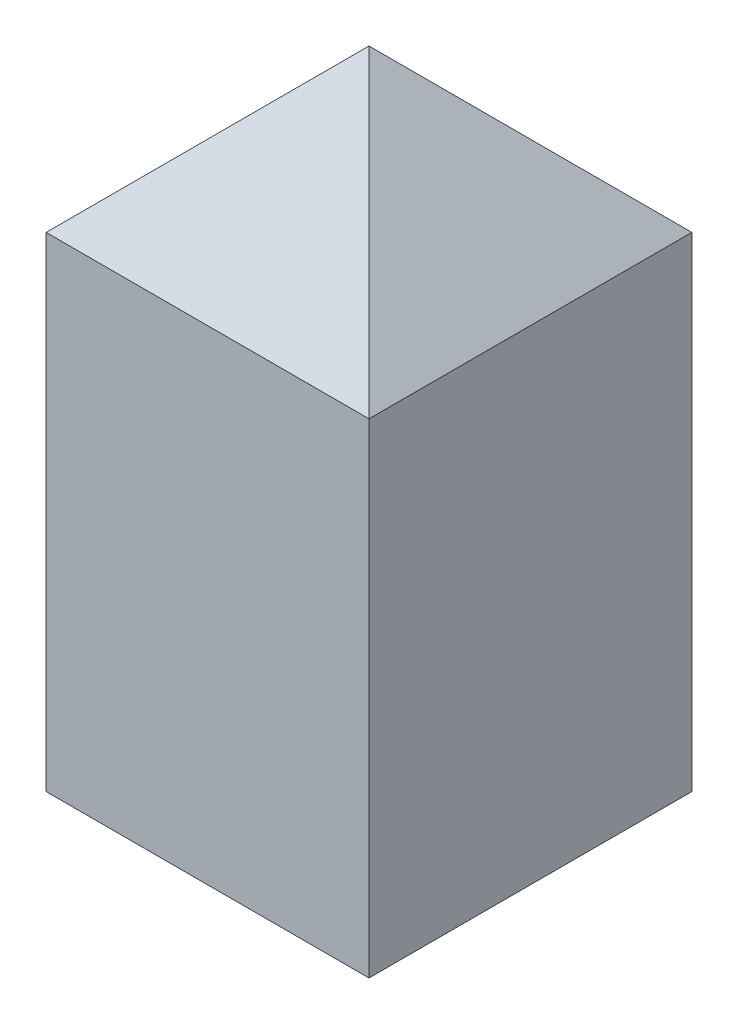
ISO-10303-21;
HEADER;
FILE_DESCRIPTION(('STEP AP214'),'2;1');
FILE_NAME('part.step','',(''),(''),'','','');
FILE_SCHEMA(('AUTOMOTIVE_DESIGN { 1 0 10303 214 1 1 1 1 }'));
ENDSEC;
DATA;
#1=APPLICATION_CONTEXT('core data for automotive mechanical design processes');
#2=APPLICATION_PROTOCOL_DEFINITION('international standard','automotive_design',2000,#1);
#3=PRODUCT_CONTEXT('',#1,'mechanical');
#4=PRODUCT('Part','Part','',(#3));
#5=PRODUCT_RELATED_PRODUCT_CATEGORY('part','',(#4));
#6=PRODUCT_DEFINITION_FORMATION('','',#4);
#7=PRODUCT_DEFINITION_CONTEXT('part definition',#1,'design');
#8=PRODUCT_DEFINITION('design','',#6,#7);
#9=PRODUCT_DEFINITION_SHAPE('','',#8);
#10=(LENGTH_UNIT() NAMED_UNIT(*) SI_UNIT(.MILLI.,.METRE.));
#11=(NAMED_UNIT(*) PLANE_ANGLE_UNIT() SI_UNIT($,.RADIAN.));
#12=(NAMED_UNIT(*) SI_UNIT($,.STERADIAN.) SOLID_ANGLE_UNIT());
#13=UNCERTAINTY_MEASURE_WITH_UNIT(LENGTH_MEASURE(1.E-05),#10,'distance_accuracy_value','');
#14=(GEOMETRIC_REPRESENTATION_CONTEXT(3) GLOBAL_UNCERTAINTY_ASSIGNED_CONTEXT((#13)) GLOBAL_UNIT_ASSIGNED_CONTEXT((#10,
#11,#12)) REPRESENTATION_CONTEXT('',''));
#15=CARTESIAN_POINT('',(0.,0.,0.));
#16=DIRECTION('',(0.,0.,1.));
#17=DIRECTION('',(1.,0.,0.));
#18=AXIS2_PLACEMENT_3D('',#15,#16,#17);
#19=CARTESIAN_POINT('',(-10.,-15.,-10.));
#20=DIRECTION('',(0.,0.,1.));
#21=DIRECTION('',(1.,0.,0.));
#22=AXIS2_PLACEMENT_3D('',#19,#20,#21);
#23=PLANE('',#22);
#24=DIRECTION('',(0.,1.,0.));
#25=VECTOR('',#24,1.);
#26=CARTESIAN_POINT('',(-10.,-15.,-10.));
#27=LINE('',#26,#25);
#28=CARTESIAN_POINT('',(-10.,-15.,-10.));
#29=VERTEX_POINT('',#28);
#30=CARTESIAN_POINT('',(-10.,15.,-10.));
#31=VERTEX_POINT('',#30);
#32=EDGE_CURVE('E194',#29,#31,#27,.T.);
#33=ORIENTED_EDGE('',*,*,#32,.T.);
#34=DIRECTION('',(1.,0.,0.));
#35=VECTOR('',#34,1.);
#36=CARTESIAN_POINT('',(-10.,15.,-10.));
#37=LINE('',#36,#35);
#38=CARTESIAN_POINT('',(10.,15.,-10.));
#39=VERTEX_POINT('',#38);
#40=EDGE_CURVE('E235',#31,#39,#37,.T.);
#41=ORIENTED_EDGE('',*,*,#40,.T.);
#42=DIRECTION('',(0.,1.,0.));
#43=VECTOR('',#42,1.);
#44=CARTESIAN_POINT('',(10.,-15.,-10.));
#45=LINE('',#44,#43);
#46=CARTESIAN_POINT('',(10.,-15.,-10.));
#47=VERTEX_POINT('',#46);
#48=EDGE_CURVE('E12',#47,#39,#45,.T.);
#49=ORIENTED_EDGE('',*,*,#48,.F.);
#50=DIRECTION('',(1.,0.,0.));
#51=VECTOR('',#50,1.);
#52=CARTESIAN_POINT('',(-10.,-15.,-10.));
#53=LINE('',#52,#51);
#54=EDGE_CURVE('E201',#29,#47,#53,.T.);
#55=ORIENTED_EDGE('',*,*,#54,.F.);
#56=EDGE_LOOP('',(#33,#41,#49,#55));
#57=FACE_BOUND('',#56,.T.);
#58=ADVANCED_FACE('F142',(#57),#23,.F.);
#59=CARTESIAN_POINT('',(10.,-15.,-10.));
#60=DIRECTION('',(-1.,0.,0.));
#61=DIRECTION('',(0.,0.,1.));
#62=AXIS2_PLACEMENT_3D('',#59,#60,#61);
#63=PLANE('',#62);
#64=ORIENTED_EDGE('',*,*,#48,.T.);
#65=DIRECTION('',(0.,0.,1.));
#66=VECTOR('',#65,1.);
#67=CARTESIAN_POINT('',(10.,15.,-10.));
#68=LINE('',#67,#66);
#69=CARTESIAN_POINT('',(10.,15.,10.));
#70=VERTEX_POINT('',#69);
#71=EDGE_CURVE('E232',#39,#70,#68,.T.);
#72=ORIENTED_EDGE('',*,*,#71,.T.);
#73=DIRECTION('',(0.,1.,0.));
#74=VECTOR('',#73,1.);
#75=CARTESIAN_POINT('',(10.,-15.,10.));
#76=LINE('',#75,#74);
#77=CARTESIAN_POINT('',(10.,-15.,10.));
#78=VERTEX_POINT('',#77);
#79=EDGE_CURVE('E149',#78,#70,#76,.T.);
#80=ORIENTED_EDGE('',*,*,#79,.F.);
#81=DIRECTION('',(0.,0.,1.));
#82=VECTOR('',#81,1.);
#83=CARTESIAN_POINT('',(10.,-15.,-10.));
#84=LINE('',#83,#82);
#85=EDGE_CURVE('E214',#47,#78,#84,.T.);
#86=ORIENTED_EDGE('',*,*,#85,.F.);
#87=EDGE_LOOP('',(#64,#72,#80,#86));
#88=FACE_BOUND('',#87,.T.);
#89=ADVANCED_FACE('F233',(#88),#63,.F.);
#90=CARTESIAN_POINT('',(-10.,-15.,10.));
#91=DIRECTION('',(0.,0.,1.));
#92=DIRECTION('',(1.,0.,0.));
#93=AXIS2_PLACEMENT_3D('',#90,#91,#92);
#94=PLANE('',#93);
#95=ORIENTED_EDGE('',*,*,#79,.T.);
#96=DIRECTION('',(1.,0.,0.));
#97=VECTOR('',#96,1.);
#98=CARTESIAN_POINT('',(-10.,15.,10.));
#99=LINE('',#98,#97);
#100=CARTESIAN_POINT('',(-10.,15.,10.));
#101=VERTEX_POINT('',#100);
#102=EDGE_CURVE('E217',#101,#70,#99,.T.);
#103=ORIENTED_EDGE('',*,*,#102,.F.);
#104=DIRECTION('',(0.,1.,0.));
#105=VECTOR('',#104,1.);
#106=CARTESIAN_POINT('',(-10.,-15.,10.));
#107=LINE('',#106,#105);
#108=CARTESIAN_POINT('',(-10.,-15.,10.));
#109=VERTEX_POINT('',#108);
#110=EDGE_CURVE('E211',#109,#101,#107,.T.);
#111=ORIENTED_EDGE('',*,*,#110,.F.);
#112=DIRECTION('',(1.,0.,0.));
#113=VECTOR('',#112,1.);
#114=CARTESIAN_POINT('',(-10.,-15.,10.));
#115=LINE('',#114,#113);
#116=EDGE_CURVE('E195',#109,#78,#115,.T.);
#117=ORIENTED_EDGE('',*,*,#116,.T.);
#118=EDGE_LOOP('',(#95,#103,#111,#117));
#119=FACE_BOUND('',#118,.T.);
#120=ADVANCED_FACE('F228',(#119),#94,.T.);
#121=CARTESIAN_POINT('',(-10.,-15.,-10.));
#122=DIRECTION('',(-1.,0.,0.));
#123=DIRECTION('',(0.,0.,1.));
#124=AXIS2_PLACEMENT_3D('',#121,#122,#123);
#125=PLANE('',#124);
#126=ORIENTED_EDGE('',*,*,#110,.T.);
#127=DIRECTION('',(0.,0.,1.));
#128=VECTOR('',#127,1.);
#129=CARTESIAN_POINT('',(-10.,15.,-10.));
#130=LINE('',#129,#128);
#131=EDGE_CURVE('E208',#31,#101,#130,.T.);
#132=ORIENTED_EDGE('',*,*,#131,.F.);
#133=ORIENTED_EDGE('',*,*,#32,.F.);
#134=DIRECTION('',(0.,0.,1.));
#135=VECTOR('',#134,1.);
#136=CARTESIAN_POINT('',(-10.,-15.,-10.));
#137=LINE('',#136,#135);
#138=EDGE_CURVE('E186',#29,#109,#137,.T.);
#139=ORIENTED_EDGE('',*,*,#138,.T.);
#140=EDGE_LOOP('',(#126,#132,#133,#139));
#141=FACE_BOUND('',#140,.T.);
#142=ADVANCED_FACE('F207',(#141),#125,.T.);
#143=CARTESIAN_POINT('',(10.,15.,9.99999999999999));
#144=DIRECTION('',(0.707106781186548,0.707106781186547,0.));
#145=DIRECTION('',(0.,0.,-1.));
#146=AXIS2_PLACEMENT_3D('',#143,#144,#145);
#147=PLANE('',#146);
#148=ORIENTED_EDGE('',*,*,#71,.F.);
#149=DIRECTION('',(-0.577350269189626,0.577350269189626,0.577350269189626));
#150=VECTOR('',#149,1.);
#151=CARTESIAN_POINT('',(5.,20.,-5.));
#152=LINE('',#151,#150);
#153=CARTESIAN_POINT('',(0.,25.,0.));
#154=VERTEX_POINT('',#153);
#155=EDGE_CURVE('E237',#39,#154,#152,.T.);
#156=ORIENTED_EDGE('',*,*,#155,.T.);
#157=DIRECTION('',(-0.577350269189626,0.577350269189626,-0.577350269189626));
#158=VECTOR('',#157,1.);
#159=CARTESIAN_POINT('',(5.,20.,5.));
#160=LINE('',#159,#158);
#161=EDGE_CURVE('E164',#70,#154,#160,.T.);
#162=ORIENTED_EDGE('',*,*,#161,.F.);
#163=EDGE_LOOP('',(#148,#156,#162));
#164=FACE_BOUND('',#163,.T.);
#165=ADVANCED_FACE('F274',(#164),#147,.T.);
#166=CARTESIAN_POINT('',(10.,15.,-10.));
#167=DIRECTION('',(0.,0.707106781186547,-0.707106781186547));
#168=DIRECTION('',(-1.,0.,0.));
#169=AXIS2_PLACEMENT_3D('',#166,#167,#168);
#170=PLANE('',#169);
#171=ORIENTED_EDGE('',*,*,#40,.F.);
#172=DIRECTION('',(0.577350269189626,0.577350269189626,0.577350269189626));
#173=VECTOR('',#172,1.);
#174=CARTESIAN_POINT('',(-5.,20.,-5.));
#175=LINE('',#174,#173);
#176=EDGE_CURVE('E244',#31,#154,#175,.T.);
#177=ORIENTED_EDGE('',*,*,#176,.T.);
#178=ORIENTED_EDGE('',*,*,#155,.F.);
#179=EDGE_LOOP('',(#171,#177,#178));
#180=FACE_BOUND('',#179,.T.);
#181=ADVANCED_FACE('F282',(#180),#170,.T.);
#182=CARTESIAN_POINT('',(-10.,15.,-10.));
#183=DIRECTION('',(-0.707106781186547,0.707106781186547,0.));
#184=DIRECTION('',(0.,0.,1.));
#185=AXIS2_PLACEMENT_3D('',#182,#183,#184);
#186=PLANE('',#185);
#187=ORIENTED_EDGE('',*,*,#131,.T.);
#188=DIRECTION('',(0.577350269189626,0.577350269189626,-0.577350269189626));
#189=VECTOR('',#188,1.);
#190=CARTESIAN_POINT('',(-5.,20.,5.));
#191=LINE('',#190,#189);
#192=EDGE_CURVE('E241',#101,#154,#191,.T.);
#193=ORIENTED_EDGE('',*,*,#192,.T.);
#194=ORIENTED_EDGE('',*,*,#176,.F.);
#195=EDGE_LOOP('',(#187,#193,#194));
#196=FACE_BOUND('',#195,.T.);
#197=ADVANCED_FACE('F278',(#196),#186,.T.);
#198=CARTESIAN_POINT('',(-10.,15.,10.));
#199=DIRECTION('',(0.,0.707106781186547,0.707106781186548));
#200=DIRECTION('',(1.,0.,0.));
#201=AXIS2_PLACEMENT_3D('',#198,#199,#200);
#202=PLANE('',#201);
#203=ORIENTED_EDGE('',*,*,#102,.T.);
#204=ORIENTED_EDGE('',*,*,#161,.T.);
#205=ORIENTED_EDGE('',*,*,#192,.F.);
#206=EDGE_LOOP('',(#203,#204,#205));
#207=FACE_BOUND('',#206,.T.);
#208=ADVANCED_FACE('F275',(#207),#202,.T.);
#209=CARTESIAN_POINT('',(-10.,-15.,9.99999999999999));
#210=DIRECTION('',(-0.707106781186554,-0.707106781186541,0.));
#211=DIRECTION('',(0.,0.,-1.));
#212=AXIS2_PLACEMENT_3D('',#209,#210,#211);
#213=PLANE('',#212);
#214=ORIENTED_EDGE('',*,*,#138,.F.);
#215=DIRECTION('',(0.577350269189619,-0.577350269189629,0.577350269189629));
#216=VECTOR('',#215,1.);
#217=CARTESIAN_POINT('',(-5.00000000000009,-20.,-5.));
#218=LINE('',#217,#216);
#219=CARTESIAN_POINT('',(-1.74574066942157E-13,-25.,0.));
#220=VERTEX_POINT('',#219);
#221=EDGE_CURVE('E189',#29,#220,#218,.T.);
#222=ORIENTED_EDGE('',*,*,#221,.T.);
#223=DIRECTION('',(0.577350269189619,-0.577350269189629,-0.577350269189629));
#224=VECTOR('',#223,1.);
#225=CARTESIAN_POINT('',(-5.00000000000009,-20.,5.));
#226=LINE('',#225,#224);
#227=EDGE_CURVE('E156',#109,#220,#226,.T.);
#228=ORIENTED_EDGE('',*,*,#227,.F.);
#229=EDGE_LOOP('',(#214,#222,#228));
#230=FACE_BOUND('',#229,.T.);
#231=ADVANCED_FACE('F188',(#230),#213,.T.);
#232=CARTESIAN_POINT('',(-10.,-15.,-10.));
#233=DIRECTION('',(0.,-0.707106781186547,-0.707106781186547));
#234=DIRECTION('',(1.,0.,0.));
#235=AXIS2_PLACEMENT_3D('',#232,#233,#234);
#236=PLANE('',#235);
#237=ORIENTED_EDGE('',*,*,#54,.T.);
#238=DIRECTION('',(-0.577350269189632,-0.577350269189622,0.577350269189622));
#239=VECTOR('',#238,1.);
#240=CARTESIAN_POINT('',(4.99999999999991,-20.,-5.));
#241=LINE('',#240,#239);
#242=EDGE_CURVE('E203',#47,#220,#241,.T.);
#243=ORIENTED_EDGE('',*,*,#242,.T.);
#244=ORIENTED_EDGE('',*,*,#221,.F.);
#245=EDGE_LOOP('',(#237,#243,#244));
#246=FACE_BOUND('',#245,.T.);
#247=ADVANCED_FACE('F199',(#246),#236,.T.);
#248=CARTESIAN_POINT('',(10.,-15.,-10.));
#249=DIRECTION('',(0.707106781186541,-0.707106781186554,0.));
#250=DIRECTION('',(0.,0.,1.));
#251=AXIS2_PLACEMENT_3D('',#248,#249,#250);
#252=PLANE('',#251);
#253=ORIENTED_EDGE('',*,*,#85,.T.);
#254=DIRECTION('',(-0.577350269189633,-0.577350269189623,-0.577350269189622));
#255=VECTOR('',#254,1.);
#256=CARTESIAN_POINT('',(4.99999999999991,-20.,5.));
#257=LINE('',#256,#255);
#258=EDGE_CURVE('E249',#78,#220,#257,.T.);
#259=ORIENTED_EDGE('',*,*,#258,.T.);
#260=ORIENTED_EDGE('',*,*,#242,.F.);
#261=EDGE_LOOP('',(#253,#259,#260));
#262=FACE_BOUND('',#261,.T.);
#263=ADVANCED_FACE('F253',(#262),#252,.T.);
#264=CARTESIAN_POINT('',(10.,-15.,10.));
#265=DIRECTION('',(0.,-0.707106781186547,0.707106781186548));
#266=DIRECTION('',(-1.,0.,0.));
#267=AXIS2_PLACEMENT_3D('',#264,#265,#266);
#268=PLANE('',#267);
#269=ORIENTED_EDGE('',*,*,#116,.F.);
#270=ORIENTED_EDGE('',*,*,#227,.T.);
#271=ORIENTED_EDGE('',*,*,#258,.F.);
#272=EDGE_LOOP('',(#269,#270,#271));
#273=FACE_BOUND('',#272,.T.);
#274=ADVANCED_FACE('F255',(#273),#268,.T.);
#275=CLOSED_SHELL('',(#58,#89,#120,#142,#165,#181,#197,#208,#231,#247,#263,#274));
#276=MANIFOLD_SOLID_BREP('B2',#275);
#277=ADVANCED_BREP_SHAPE_REPRESENTATION('',(#18,#276),#14);
#278=SHAPE_DEFINITION_REPRESENTATION(#9,#277);
ENDSEC;
END-ISO-10303-21;
